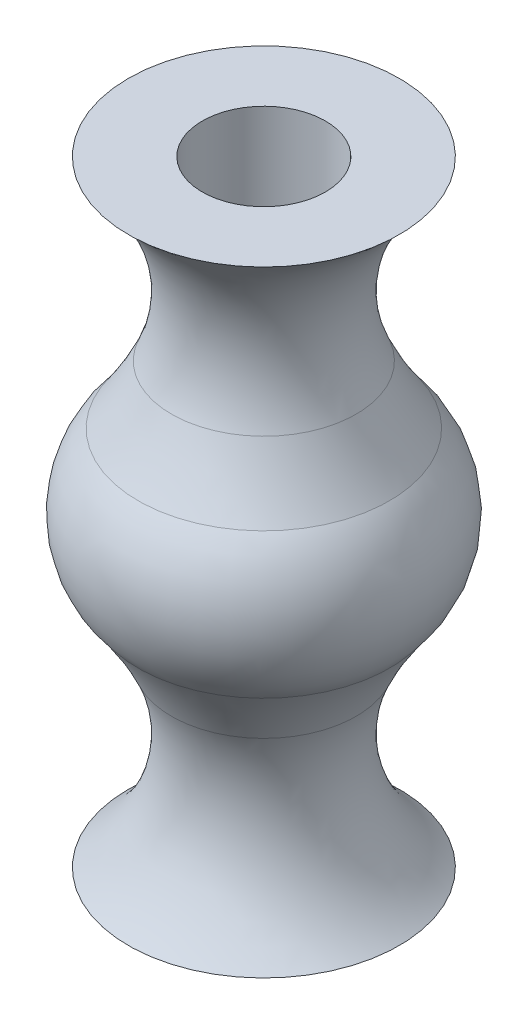
ISO-10303-21;
HEADER;
FILE_DESCRIPTION(('STEP AP214'),'2;1');
FILE_NAME('part.step','',(''),(''),'','','');
FILE_SCHEMA(('AUTOMOTIVE_DESIGN { 1 0 10303 214 1 1 1 1 }'));
ENDSEC;
DATA;
#1=APPLICATION_CONTEXT('core data for automotive mechanical design processes');
#2=APPLICATION_PROTOCOL_DEFINITION('international standard','automotive_design',2000,#1);
#3=PRODUCT_CONTEXT('',#1,'mechanical');
#4=PRODUCT('Part','Part','',(#3));
#5=PRODUCT_RELATED_PRODUCT_CATEGORY('part','',(#4));
#6=PRODUCT_DEFINITION_FORMATION('','',#4);
#7=PRODUCT_DEFINITION_CONTEXT('part definition',#1,'design');
#8=PRODUCT_DEFINITION('design','',#6,#7);
#9=PRODUCT_DEFINITION_SHAPE('','',#8);
#10=(LENGTH_UNIT() NAMED_UNIT(*) SI_UNIT(.MILLI.,.METRE.));
#11=(NAMED_UNIT(*) PLANE_ANGLE_UNIT() SI_UNIT($,.RADIAN.));
#12=(NAMED_UNIT(*) SI_UNIT($,.STERADIAN.) SOLID_ANGLE_UNIT());
#13=UNCERTAINTY_MEASURE_WITH_UNIT(LENGTH_MEASURE(1.E-05),#10,'distance_accuracy_value','');
#14=(GEOMETRIC_REPRESENTATION_CONTEXT(3) GLOBAL_UNCERTAINTY_ASSIGNED_CONTEXT((#13)) GLOBAL_UNIT_ASSIGNED_CONTEXT((#10,
#11,#12)) REPRESENTATION_CONTEXT('',''));
#15=CARTESIAN_POINT('',(0.,0.,0.));
#16=DIRECTION('',(0.,0.,1.));
#17=DIRECTION('',(1.,0.,0.));
#18=AXIS2_PLACEMENT_3D('',#15,#16,#17);
#19=CARTESIAN_POINT('',(-2.2,-5.,0.));
#20=DIRECTION('',(0.,-1.,0.));
#21=DIRECTION('',(1.,0.,0.));
#22=AXIS2_PLACEMENT_3D('',#19,#20,#21);
#23=PLANE('',#22);
#24=CARTESIAN_POINT('',(0.,-5.,0.));
#25=DIRECTION('',(0.,-1.,0.));
#26=DIRECTION('',(1.,0.,0.));
#27=AXIS2_PLACEMENT_3D('',#24,#25,#26);
#28=CIRCLE('',#27,1.);
#29=CARTESIAN_POINT('',(1.,-5.,0.));
#30=VERTEX_POINT('',#29);
#31=EDGE_CURVE('E56',#30,#30,#28,.T.);
#32=ORIENTED_EDGE('',*,*,#31,.F.);
#33=EDGE_LOOP('',(#32));
#34=FACE_BOUND('',#33,.T.);
#35=CARTESIAN_POINT('',(0.,-5.,0.));
#36=DIRECTION('',(0.,1.,0.));
#37=DIRECTION('',(-1.,0.,0.));
#38=AXIS2_PLACEMENT_3D('',#35,#36,#37);
#39=CIRCLE('',#38,2.2);
#40=CARTESIAN_POINT('',(-2.2,-5.,0.));
#41=VERTEX_POINT('',#40);
#42=EDGE_CURVE('E52',#41,#41,#39,.T.);
#43=ORIENTED_EDGE('',*,*,#42,.F.);
#44=EDGE_LOOP('',(#43));
#45=FACE_BOUND('',#44,.T.);
#46=ADVANCED_FACE('F30',(#34,#45),#23,.T.);
#47=CARTESIAN_POINT('',(-2.2,5.,0.));
#48=DIRECTION('',(0.,1.,0.));
#49=DIRECTION('',(-1.,0.,0.));
#50=AXIS2_PLACEMENT_3D('',#47,#48,#49);
#51=PLANE('',#50);
#52=CARTESIAN_POINT('',(0.,5.,0.));
#53=DIRECTION('',(0.,-1.,0.));
#54=DIRECTION('',(1.,0.,0.));
#55=AXIS2_PLACEMENT_3D('',#52,#53,#54);
#56=CIRCLE('',#55,1.);
#57=CARTESIAN_POINT('',(1.,5.,0.));
#58=VERTEX_POINT('',#57);
#59=EDGE_CURVE('E55',#58,#58,#56,.T.);
#60=ORIENTED_EDGE('',*,*,#59,.T.);
#61=EDGE_LOOP('',(#60));
#62=FACE_BOUND('',#61,.T.);
#63=CARTESIAN_POINT('',(0.,5.,0.));
#64=DIRECTION('',(0.,1.,0.));
#65=DIRECTION('',(-1.,0.,0.));
#66=AXIS2_PLACEMENT_3D('',#63,#64,#65);
#67=CIRCLE('',#66,2.2);
#68=CARTESIAN_POINT('',(-2.2,5.,0.));
#69=VERTEX_POINT('',#68);
#70=EDGE_CURVE('E10',#69,#69,#67,.T.);
#71=ORIENTED_EDGE('',*,*,#70,.T.);
#72=EDGE_LOOP('',(#71));
#73=FACE_BOUND('',#72,.T.);
#74=ADVANCED_FACE('F62',(#62,#73),#51,.T.);
#75=CARTESIAN_POINT('',(0.,3.11172702129174,0.));
#76=DIRECTION('',(0.,1.,0.));
#77=DIRECTION('',(-1.,0.,0.));
#78=AXIS2_PLACEMENT_3D('',#75,#76,#77);
#79=TOROIDAL_SURFACE('',#78,3.70149440125434,2.41248010957974);
#80=CARTESIAN_POINT('',(0.,2.12507476220363,0.));
#81=DIRECTION('',(0.,1.,0.));
#82=DIRECTION('',(-1.,0.,0.));
#83=AXIS2_PLACEMENT_3D('',#80,#81,#82);
#84=CIRCLE('',#83,1.5);
#85=CARTESIAN_POINT('',(-1.5,2.12507476220363,0.));
#86=VERTEX_POINT('',#85);
#87=EDGE_CURVE('E36',#86,#86,#84,.T.);
#88=ORIENTED_EDGE('',*,*,#87,.T.);
#89=EDGE_LOOP('',(#88));
#90=FACE_BOUND('',#89,.T.);
#91=ORIENTED_EDGE('',*,*,#70,.F.);
#92=EDGE_LOOP('',(#91));
#93=FACE_BOUND('',#92,.T.);
#94=ADVANCED_FACE('F95',(#90,#93),#79,.F.);
#95=CARTESIAN_POINT('',(0.,4.39714831177617,0.));
#96=DIRECTION('',(0.,1.,0.));
#97=DIRECTION('',(-1.,0.,0.));
#98=AXIS2_PLACEMENT_3D('',#95,#96,#97);
#99=TOROIDAL_SURFACE('',#98,6.56962524288442,5.55548542595137);
#100=CARTESIAN_POINT('',(0.,1.17747077202402,0.));
#101=DIRECTION('',(0.,1.,0.));
#102=DIRECTION('',(-1.,0.,0.));
#103=AXIS2_PLACEMENT_3D('',#100,#101,#102);
#104=CIRCLE('',#103,2.04225350445012);
#105=CARTESIAN_POINT('',(-2.04225350445012,1.17747077202402,0.));
#106=VERTEX_POINT('',#105);
#107=EDGE_CURVE('E40',#106,#106,#104,.T.);
#108=ORIENTED_EDGE('',*,*,#107,.T.);
#109=EDGE_LOOP('',(#108));
#110=FACE_BOUND('',#109,.T.);
#111=ORIENTED_EDGE('',*,*,#87,.F.);
#112=EDGE_LOOP('',(#111));
#113=FACE_BOUND('',#112,.T.);
#114=ADVANCED_FACE('F89',(#110,#113),#99,.F.);
#115=CARTESIAN_POINT('',(0.,0.,0.));
#116=DIRECTION('',(0.,1.,0.));
#117=DIRECTION('',(-1.,0.,0.));
#118=AXIS2_PLACEMENT_3D('',#115,#116,#117);
#119=DEGENERATE_TOROIDAL_SURFACE('',#118,0.756710549753265,1.74328945024673,.T.);
#120=CARTESIAN_POINT('',(0.,-1.17747077202402,0.));
#121=DIRECTION('',(0.,1.,0.));
#122=DIRECTION('',(-1.,0.,0.));
#123=AXIS2_PLACEMENT_3D('',#120,#121,#122);
#124=CIRCLE('',#123,2.04225350445012);
#125=CARTESIAN_POINT('',(-2.04225350445012,-1.17747077202402,0.));
#126=VERTEX_POINT('',#125);
#127=EDGE_CURVE('E44',#126,#126,#124,.T.);
#128=ORIENTED_EDGE('',*,*,#127,.T.);
#129=EDGE_LOOP('',(#128));
#130=FACE_BOUND('',#129,.T.);
#131=ORIENTED_EDGE('',*,*,#107,.F.);
#132=EDGE_LOOP('',(#131));
#133=FACE_BOUND('',#132,.T.);
#134=ADVANCED_FACE('F83',(#130,#133),#119,.T.);
#135=CARTESIAN_POINT('',(0.,-4.39714831177618,0.));
#136=DIRECTION('',(0.,1.,0.));
#137=DIRECTION('',(-1.,0.,0.));
#138=AXIS2_PLACEMENT_3D('',#135,#136,#137);
#139=TOROIDAL_SURFACE('',#138,6.56962524288442,5.55548542595137);
#140=CARTESIAN_POINT('',(0.,-2.12507476220363,0.));
#141=DIRECTION('',(0.,1.,0.));
#142=DIRECTION('',(-1.,0.,0.));
#143=AXIS2_PLACEMENT_3D('',#140,#141,#142);
#144=CIRCLE('',#143,1.5);
#145=CARTESIAN_POINT('',(-1.5,-2.12507476220363,0.));
#146=VERTEX_POINT('',#145);
#147=EDGE_CURVE('E49',#146,#146,#144,.T.);
#148=ORIENTED_EDGE('',*,*,#147,.T.);
#149=EDGE_LOOP('',(#148));
#150=FACE_BOUND('',#149,.T.);
#151=ORIENTED_EDGE('',*,*,#127,.F.);
#152=EDGE_LOOP('',(#151));
#153=FACE_BOUND('',#152,.T.);
#154=ADVANCED_FACE('F77',(#150,#153),#139,.F.);
#155=CARTESIAN_POINT('',(0.,-3.11172702129174,0.));
#156=DIRECTION('',(0.,1.,0.));
#157=DIRECTION('',(-1.,0.,0.));
#158=AXIS2_PLACEMENT_3D('',#155,#156,#157);
#159=TOROIDAL_SURFACE('',#158,3.70149440125434,2.41248010957974);
#160=ORIENTED_EDGE('',*,*,#42,.T.);
#161=EDGE_LOOP('',(#160));
#162=FACE_BOUND('',#161,.T.);
#163=ORIENTED_EDGE('',*,*,#147,.F.);
#164=EDGE_LOOP('',(#163));
#165=FACE_BOUND('',#164,.T.);
#166=ADVANCED_FACE('F67',(#162,#165),#159,.F.);
#167=CARTESIAN_POINT('',(0.,5.,0.));
#168=DIRECTION('',(0.,-1.,0.));
#169=DIRECTION('',(1.,0.,0.));
#170=AXIS2_PLACEMENT_3D('',#167,#168,#169);
#171=CYLINDRICAL_SURFACE('',#170,1.);
#172=ORIENTED_EDGE('',*,*,#59,.F.);
#173=EDGE_LOOP('',(#172));
#174=FACE_BOUND('',#173,.T.);
#175=ORIENTED_EDGE('',*,*,#31,.T.);
#176=EDGE_LOOP('',(#175));
#177=FACE_BOUND('',#176,.T.);
#178=ADVANCED_FACE('F64',(#174,#177),#171,.F.);
#179=CLOSED_SHELL('',(#46,#74,#94,#114,#134,#154,#166,#178));
#180=MANIFOLD_SOLID_BREP('B2',#179);
#181=ADVANCED_BREP_SHAPE_REPRESENTATION('',(#18,#180),#14);
#182=SHAPE_DEFINITION_REPRESENTATION(#9,#181);
ENDSEC;
END-ISO-10303-21;
